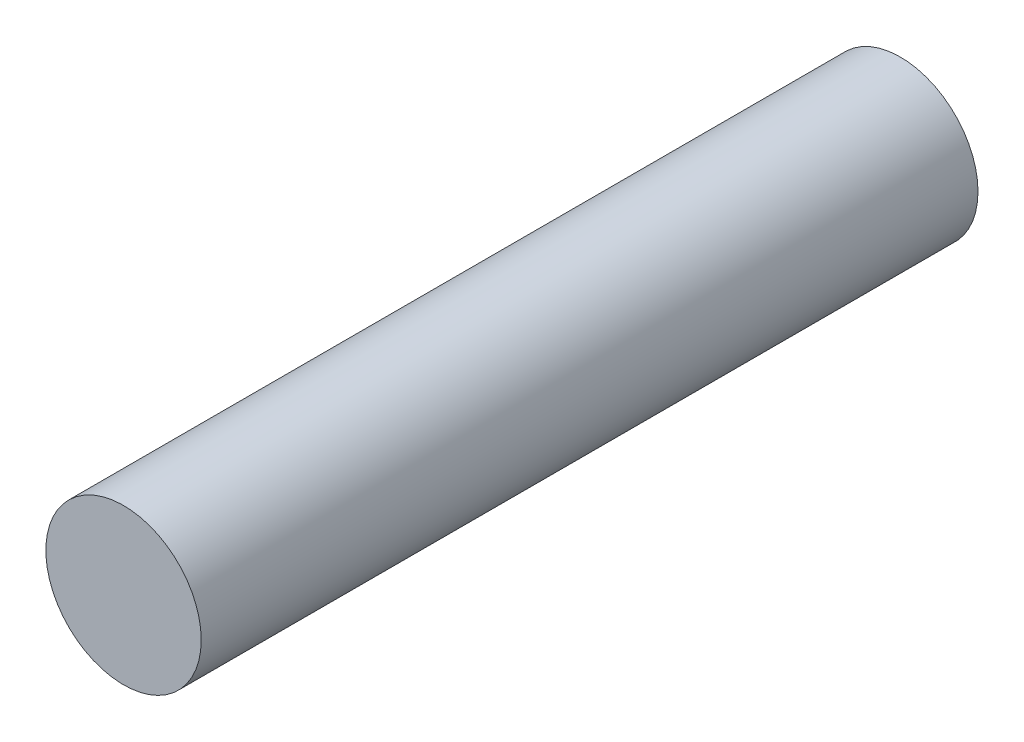
ISO-10303-21;
HEADER;
FILE_DESCRIPTION(('STEP AP214'),'2;1');
FILE_NAME('part.step','',(''),(''),'','','');
FILE_SCHEMA(('AUTOMOTIVE_DESIGN { 1 0 10303 214 1 1 1 1 }'));
ENDSEC;
DATA;
#1=APPLICATION_CONTEXT('core data for automotive mechanical design processes');
#2=APPLICATION_PROTOCOL_DEFINITION('international standard','automotive_design',2000,#1);
#3=PRODUCT_CONTEXT('',#1,'mechanical');
#4=PRODUCT('Part','Part','',(#3));
#5=PRODUCT_RELATED_PRODUCT_CATEGORY('part','',(#4));
#6=PRODUCT_DEFINITION_FORMATION('','',#4);
#7=PRODUCT_DEFINITION_CONTEXT('part definition',#1,'design');
#8=PRODUCT_DEFINITION('design','',#6,#7);
#9=PRODUCT_DEFINITION_SHAPE('','',#8);
#10=(LENGTH_UNIT() NAMED_UNIT(*) SI_UNIT(.MILLI.,.METRE.));
#11=(NAMED_UNIT(*) PLANE_ANGLE_UNIT() SI_UNIT($,.RADIAN.));
#12=(NAMED_UNIT(*) SI_UNIT($,.STERADIAN.) SOLID_ANGLE_UNIT());
#13=UNCERTAINTY_MEASURE_WITH_UNIT(LENGTH_MEASURE(1.E-05),#10,'distance_accuracy_value','');
#14=(GEOMETRIC_REPRESENTATION_CONTEXT(3) GLOBAL_UNCERTAINTY_ASSIGNED_CONTEXT((#13)) GLOBAL_UNIT_ASSIGNED_CONTEXT((#10,
#11,#12)) REPRESENTATION_CONTEXT('',''));
#15=CARTESIAN_POINT('',(0.,0.,0.));
#16=DIRECTION('',(0.,0.,1.));
#17=DIRECTION('',(1.,0.,0.));
#18=AXIS2_PLACEMENT_3D('',#15,#16,#17);
#19=CARTESIAN_POINT('',(0.,0.,10.));
#20=DIRECTION('',(0.,0.,-1.));
#21=DIRECTION('',(-1.,0.,0.));
#22=AXIS2_PLACEMENT_3D('',#19,#20,#21);
#23=CYLINDRICAL_SURFACE('',#22,1.);
#24=CARTESIAN_POINT('',(0.,0.,10.));
#25=DIRECTION('',(0.,0.,1.));
#26=DIRECTION('',(1.,0.,0.));
#27=AXIS2_PLACEMENT_3D('',#24,#25,#26);
#28=CIRCLE('',#27,1.);
#29=CARTESIAN_POINT('',(1.,0.,10.));
#30=VERTEX_POINT('',#29);
#31=EDGE_CURVE('E10',#30,#30,#28,.T.);
#32=ORIENTED_EDGE('',*,*,#31,.F.);
#33=EDGE_LOOP('',(#32));
#34=FACE_BOUND('',#33,.T.);
#35=CARTESIAN_POINT('',(0.,0.,0.));
#36=DIRECTION('',(0.,0.,1.));
#37=DIRECTION('',(1.,0.,0.));
#38=AXIS2_PLACEMENT_3D('',#35,#36,#37);
#39=CIRCLE('',#38,1.);
#40=CARTESIAN_POINT('',(1.,0.,0.));
#41=VERTEX_POINT('',#40);
#42=EDGE_CURVE('E35',#41,#41,#39,.T.);
#43=ORIENTED_EDGE('',*,*,#42,.T.);
#44=EDGE_LOOP('',(#43));
#45=FACE_BOUND('',#44,.T.);
#46=ADVANCED_FACE('F32',(#34,#45),#23,.T.);
#47=CARTESIAN_POINT('',(0.,0.,10.));
#48=DIRECTION('',(0.,0.,1.));
#49=DIRECTION('',(1.,0.,0.));
#50=AXIS2_PLACEMENT_3D('',#47,#48,#49);
#51=PLANE('',#50);
#52=ORIENTED_EDGE('',*,*,#31,.T.);
#53=EDGE_LOOP('',(#52));
#54=FACE_BOUND('',#53,.T.);
#55=ADVANCED_FACE('F47',(#54),#51,.T.);
#56=CARTESIAN_POINT('',(0.,0.,0.));
#57=DIRECTION('',(0.,0.,1.));
#58=DIRECTION('',(1.,0.,0.));
#59=AXIS2_PLACEMENT_3D('',#56,#57,#58);
#60=PLANE('',#59);
#61=ORIENTED_EDGE('',*,*,#42,.F.);
#62=EDGE_LOOP('',(#61));
#63=FACE_BOUND('',#62,.T.);
#64=ADVANCED_FACE('F45',(#63),#60,.F.);
#65=CLOSED_SHELL('',(#46,#55,#64));
#66=MANIFOLD_SOLID_BREP('B2',#65);
#67=ADVANCED_BREP_SHAPE_REPRESENTATION('',(#18,#66),#14);
#68=SHAPE_DEFINITION_REPRESENTATION(#9,#67);
ENDSEC;
END-ISO-10303-21;
